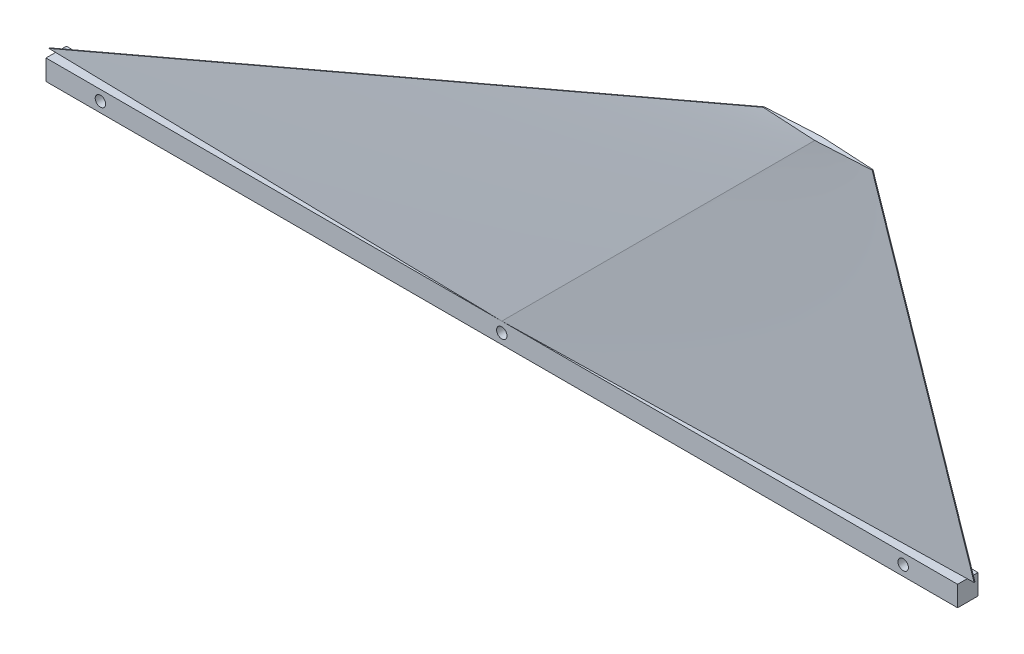
ISO-10303-21;
HEADER;
FILE_DESCRIPTION(('STEP AP214'),'2;1');
FILE_NAME('part.step','',(''),(''),'','','');
FILE_SCHEMA(('AUTOMOTIVE_DESIGN { 1 0 10303 214 1 1 1 1 }'));
ENDSEC;
DATA;
#1=APPLICATION_CONTEXT('core data for automotive mechanical design processes');
#2=APPLICATION_PROTOCOL_DEFINITION('international standard','automotive_design',2000,#1);
#3=PRODUCT_CONTEXT('',#1,'mechanical');
#4=PRODUCT('Part','Part','',(#3));
#5=PRODUCT_RELATED_PRODUCT_CATEGORY('part','',(#4));
#6=PRODUCT_DEFINITION_FORMATION('','',#4);
#7=PRODUCT_DEFINITION_CONTEXT('part definition',#1,'design');
#8=PRODUCT_DEFINITION('design','',#6,#7);
#9=PRODUCT_DEFINITION_SHAPE('','',#8);
#10=(LENGTH_UNIT() NAMED_UNIT(*) SI_UNIT(.MILLI.,.METRE.));
#11=(NAMED_UNIT(*) PLANE_ANGLE_UNIT() SI_UNIT($,.RADIAN.));
#12=(NAMED_UNIT(*) SI_UNIT($,.STERADIAN.) SOLID_ANGLE_UNIT());
#13=UNCERTAINTY_MEASURE_WITH_UNIT(LENGTH_MEASURE(1.E-05),#10,'distance_accuracy_value','');
#14=(GEOMETRIC_REPRESENTATION_CONTEXT(3) GLOBAL_UNCERTAINTY_ASSIGNED_CONTEXT((#13)) GLOBAL_UNIT_ASSIGNED_CONTEXT((#10,
#11,#12)) REPRESENTATION_CONTEXT('',''));
#15=CARTESIAN_POINT('',(0.,0.,0.));
#16=DIRECTION('',(0.,0.,1.));
#17=DIRECTION('',(1.,0.,0.));
#18=AXIS2_PLACEMENT_3D('',#15,#16,#17);
#19=CARTESIAN_POINT('',(0.,9.52500000000001,0.));
#20=DIRECTION('',(0.,1.,0.));
#21=DIRECTION('',(0.,0.,1.));
#22=AXIS2_PLACEMENT_3D('',#19,#20,#21);
#23=PLANE('',#22);
#24=DIRECTION('',(0.,0.,1.));
#25=VECTOR('',#24,1.);
#26=CARTESIAN_POINT('',(-212.725,9.52500000000001,-4.77300000000003));
#27=LINE('',#26,#25);
#28=CARTESIAN_POINT('',(-212.725,9.52500000000001,-4.7625));
#29=VERTEX_POINT('',#28);
#30=CARTESIAN_POINT('',(-212.725,9.52500000000001,-0.270248529411765));
#31=VERTEX_POINT('',#30);
#32=EDGE_CURVE('E490',#29,#31,#27,.T.);
#33=ORIENTED_EDGE('',*,*,#32,.T.);
#34=DIRECTION('',(-0.999777097042099,0.,0.0211129398728302));
#35=VECTOR('',#34,1.);
#36=CARTESIAN_POINT('',(0.,9.52500000000001,-4.7625));
#37=LINE('',#36,#35);
#38=CARTESIAN_POINT('',(0.,9.52500000000001,-4.7625));
#39=VERTEX_POINT('',#38);
#40=EDGE_CURVE('E261',#39,#31,#37,.T.);
#41=ORIENTED_EDGE('',*,*,#40,.F.);
#42=DIRECTION('',(-1.,0.,0.));
#43=VECTOR('',#42,1.);
#44=CARTESIAN_POINT('',(-215.9,9.52500000000001,-4.7625));
#45=LINE('',#44,#43);
#46=EDGE_CURVE('E256',#39,#29,#45,.T.);
#47=ORIENTED_EDGE('',*,*,#46,.T.);
#48=EDGE_LOOP('',(#33,#41,#47));
#49=FACE_BOUND('',#48,.T.);
#50=ADVANCED_FACE('F134',(#49),#23,.T.);
#51=DIRECTION('',(0.,0.,1.));
#52=VECTOR('',#51,1.);
#53=CARTESIAN_POINT('',(212.725,9.52500000000001,-4.77300000000003));
#54=LINE('',#53,#52);
#55=CARTESIAN_POINT('',(212.725,9.52500000000001,-4.7625));
#56=VERTEX_POINT('',#55);
#57=CARTESIAN_POINT('',(212.725,9.52500000000001,-0.270248529411765));
#58=VERTEX_POINT('',#57);
#59=EDGE_CURVE('E239',#56,#58,#54,.T.);
#60=ORIENTED_EDGE('',*,*,#59,.F.);
#61=EDGE_CURVE('E138',#56,#39,#45,.T.);
#62=ORIENTED_EDGE('',*,*,#61,.T.);
#63=DIRECTION('',(-0.999777097042099,0.,-0.0211129398728302));
#64=VECTOR('',#63,1.);
#65=CARTESIAN_POINT('',(215.9,9.52500000000001,-0.203200000000014));
#66=LINE('',#65,#64);
#67=EDGE_CURVE('E277',#58,#39,#66,.T.);
#68=ORIENTED_EDGE('',*,*,#67,.F.);
#69=EDGE_LOOP('',(#60,#62,#68));
#70=FACE_BOUND('',#69,.T.);
#71=ADVANCED_FACE('F450',(#70),#23,.T.);
#72=CARTESIAN_POINT('',(212.725,9.52500000000001,0.270248529411765));
#73=VERTEX_POINT('',#72);
#74=CARTESIAN_POINT('',(212.725,9.52500000000001,4.7625));
#75=VERTEX_POINT('',#74);
#76=EDGE_CURVE('E228',#73,#75,#54,.T.);
#77=ORIENTED_EDGE('',*,*,#76,.F.);
#78=DIRECTION('',(0.999777097042099,0.,-0.0211129398728302));
#79=VECTOR('',#78,1.);
#80=CARTESIAN_POINT('',(0.,9.52500000000001,4.7625));
#81=LINE('',#80,#79);
#82=CARTESIAN_POINT('',(0.,9.52500000000001,4.7625));
#83=VERTEX_POINT('',#82);
#84=EDGE_CURVE('E252',#83,#73,#81,.T.);
#85=ORIENTED_EDGE('',*,*,#84,.F.);
#86=DIRECTION('',(1.,0.,0.));
#87=VECTOR('',#86,1.);
#88=CARTESIAN_POINT('',(-215.9,9.52500000000001,4.7625));
#89=LINE('',#88,#87);
#90=EDGE_CURVE('E245',#83,#75,#89,.T.);
#91=ORIENTED_EDGE('',*,*,#90,.T.);
#92=EDGE_LOOP('',(#77,#85,#91));
#93=FACE_BOUND('',#92,.T.);
#94=ADVANCED_FACE('F251',(#93),#23,.T.);
#95=CARTESIAN_POINT('',(-212.725,9.52500000000001,0.270248529411765));
#96=VERTEX_POINT('',#95);
#97=CARTESIAN_POINT('',(-212.725,9.52500000000001,4.7625));
#98=VERTEX_POINT('',#97);
#99=EDGE_CURVE('E486',#96,#98,#27,.T.);
#100=ORIENTED_EDGE('',*,*,#99,.T.);
#101=EDGE_CURVE('E253',#98,#83,#89,.T.);
#102=ORIENTED_EDGE('',*,*,#101,.T.);
#103=DIRECTION('',(0.999777097042099,0.,0.0211129398728302));
#104=VECTOR('',#103,1.);
#105=CARTESIAN_POINT('',(-215.9,9.52500000000001,0.203200000000014));
#106=LINE('',#105,#104);
#107=EDGE_CURVE('E286',#96,#83,#106,.T.);
#108=ORIENTED_EDGE('',*,*,#107,.F.);
#109=EDGE_LOOP('',(#100,#102,#108));
#110=FACE_BOUND('',#109,.T.);
#111=ADVANCED_FACE('F452',(#110),#23,.T.);
#112=CARTESIAN_POINT('',(-215.9,9.52500000000001,-4.7625));
#113=DIRECTION('',(0.,0.,1.));
#114=DIRECTION('',(1.,0.,0.));
#115=AXIS2_PLACEMENT_3D('',#112,#113,#114);
#116=PLANE('',#115);
#117=CARTESIAN_POINT('',(0.,4.76250000000003,-4.7625));
#118=DIRECTION('',(0.,0.,1.));
#119=DIRECTION('',(1.,0.,0.));
#120=AXIS2_PLACEMENT_3D('',#117,#118,#119);
#121=CIRCLE('',#120,2.4384);
#122=CARTESIAN_POINT('',(2.43839999999994,4.76250000000003,-4.7625));
#123=VERTEX_POINT('',#122);
#124=EDGE_CURVE('E613',#123,#123,#121,.T.);
#125=ORIENTED_EDGE('',*,*,#124,.T.);
#126=EDGE_LOOP('',(#125));
#127=FACE_BOUND('',#126,.T.);
#128=CARTESIAN_POINT('',(187.325,4.76250000000004,-4.7625));
#129=DIRECTION('',(0.,0.,1.));
#130=DIRECTION('',(1.,0.,0.));
#131=AXIS2_PLACEMENT_3D('',#128,#129,#130);
#132=CIRCLE('',#131,2.4384);
#133=CARTESIAN_POINT('',(189.7634,4.76250000000004,-4.7625));
#134=VERTEX_POINT('',#133);
#135=EDGE_CURVE('E473',#134,#134,#132,.T.);
#136=ORIENTED_EDGE('',*,*,#135,.T.);
#137=EDGE_LOOP('',(#136));
#138=FACE_BOUND('',#137,.T.);
#139=CARTESIAN_POINT('',(-187.325,4.7625,-4.7625));
#140=DIRECTION('',(0.,0.,1.));
#141=DIRECTION('',(1.,0.,0.));
#142=AXIS2_PLACEMENT_3D('',#139,#140,#141);
#143=CIRCLE('',#142,2.4384);
#144=CARTESIAN_POINT('',(-184.8866,4.7625,-4.7625));
#145=VERTEX_POINT('',#144);
#146=EDGE_CURVE('E249',#145,#145,#143,.T.);
#147=ORIENTED_EDGE('',*,*,#146,.T.);
#148=EDGE_LOOP('',(#147));
#149=FACE_BOUND('',#148,.T.);
#150=ORIENTED_EDGE('',*,*,#61,.F.);
#151=DIRECTION('',(0.,-1.,0.));
#152=VECTOR('',#151,1.);
#153=CARTESIAN_POINT('',(212.725,9.52500000000001,-4.7625));
#154=LINE('',#153,#152);
#155=CARTESIAN_POINT('',(212.725,0.,-4.7625));
#156=VERTEX_POINT('',#155);
#157=EDGE_CURVE('E481',#56,#156,#154,.T.);
#158=ORIENTED_EDGE('',*,*,#157,.T.);
#159=DIRECTION('',(-1.,0.,0.));
#160=VECTOR('',#159,1.);
#161=CARTESIAN_POINT('',(-215.9,0.,-4.7625));
#162=LINE('',#161,#160);
#163=CARTESIAN_POINT('',(-212.725,0.,-4.7625));
#164=VERTEX_POINT('',#163);
#165=EDGE_CURVE('E267',#156,#164,#162,.T.);
#166=ORIENTED_EDGE('',*,*,#165,.T.);
#167=DIRECTION('',(0.,1.,0.));
#168=VECTOR('',#167,1.);
#169=CARTESIAN_POINT('',(-212.725,9.52500000000001,-4.7625));
#170=LINE('',#169,#168);
#171=EDGE_CURVE('E295',#164,#29,#170,.T.);
#172=ORIENTED_EDGE('',*,*,#171,.T.);
#173=ORIENTED_EDGE('',*,*,#46,.F.);
#174=EDGE_LOOP('',(#150,#158,#166,#172,#173));
#175=FACE_BOUND('',#174,.T.);
#176=ADVANCED_FACE('F136',(#127,#138,#149,#175),#116,.F.);
#177=CARTESIAN_POINT('',(-215.9,9.52500000000001,4.7625));
#178=DIRECTION('',(0.,0.,-1.));
#179=DIRECTION('',(-1.,0.,0.));
#180=AXIS2_PLACEMENT_3D('',#177,#178,#179);
#181=PLANE('',#180);
#182=CARTESIAN_POINT('',(0.,4.76250000000003,4.7625));
#183=DIRECTION('',(0.,0.,1.));
#184=DIRECTION('',(1.,0.,0.));
#185=AXIS2_PLACEMENT_3D('',#182,#183,#184);
#186=CIRCLE('',#185,2.4384);
#187=CARTESIAN_POINT('',(2.43839999999994,4.76250000000003,4.7625));
#188=VERTEX_POINT('',#187);
#189=EDGE_CURVE('E464',#188,#188,#186,.T.);
#190=ORIENTED_EDGE('',*,*,#189,.F.);
#191=EDGE_LOOP('',(#190));
#192=FACE_BOUND('',#191,.T.);
#193=CARTESIAN_POINT('',(187.325,4.76250000000004,4.7625));
#194=DIRECTION('',(0.,0.,1.));
#195=DIRECTION('',(1.,0.,0.));
#196=AXIS2_PLACEMENT_3D('',#193,#194,#195);
#197=CIRCLE('',#196,2.4384);
#198=CARTESIAN_POINT('',(189.7634,4.76250000000004,4.7625));
#199=VERTEX_POINT('',#198);
#200=EDGE_CURVE('E468',#199,#199,#197,.T.);
#201=ORIENTED_EDGE('',*,*,#200,.F.);
#202=EDGE_LOOP('',(#201));
#203=FACE_BOUND('',#202,.T.);
#204=CARTESIAN_POINT('',(-187.325,4.7625,4.7625));
#205=DIRECTION('',(0.,0.,1.));
#206=DIRECTION('',(1.,0.,0.));
#207=AXIS2_PLACEMENT_3D('',#204,#205,#206);
#208=CIRCLE('',#207,2.4384);
#209=CARTESIAN_POINT('',(-184.8866,4.7625,4.7625));
#210=VERTEX_POINT('',#209);
#211=EDGE_CURVE('E471',#210,#210,#208,.T.);
#212=ORIENTED_EDGE('',*,*,#211,.F.);
#213=EDGE_LOOP('',(#212));
#214=FACE_BOUND('',#213,.T.);
#215=DIRECTION('',(1.,0.,0.));
#216=VECTOR('',#215,1.);
#217=CARTESIAN_POINT('',(-215.9,0.,4.7625));
#218=LINE('',#217,#216);
#219=CARTESIAN_POINT('',(-212.725,0.,4.7625));
#220=VERTEX_POINT('',#219);
#221=CARTESIAN_POINT('',(212.725,0.,4.7625));
#222=VERTEX_POINT('',#221);
#223=EDGE_CURVE('E248',#220,#222,#218,.T.);
#224=ORIENTED_EDGE('',*,*,#223,.T.);
#225=DIRECTION('',(0.,-1.,0.));
#226=VECTOR('',#225,1.);
#227=CARTESIAN_POINT('',(212.725,9.52500000000001,4.7625));
#228=LINE('',#227,#226);
#229=EDGE_CURVE('E232',#75,#222,#228,.T.);
#230=ORIENTED_EDGE('',*,*,#229,.F.);
#231=ORIENTED_EDGE('',*,*,#90,.F.);
#232=ORIENTED_EDGE('',*,*,#101,.F.);
#233=DIRECTION('',(0.,1.,0.));
#234=VECTOR('',#233,1.);
#235=CARTESIAN_POINT('',(-212.725,9.52500000000001,4.7625));
#236=LINE('',#235,#234);
#237=EDGE_CURVE('E484',#220,#98,#236,.T.);
#238=ORIENTED_EDGE('',*,*,#237,.F.);
#239=EDGE_LOOP('',(#224,#230,#231,#232,#238));
#240=FACE_BOUND('',#239,.T.);
#241=ADVANCED_FACE('F243',(#192,#203,#214,#240),#181,.F.);
#242=CARTESIAN_POINT('',(0.,0.,0.));
#243=DIRECTION('',(0.,1.,0.));
#244=DIRECTION('',(0.,0.,1.));
#245=AXIS2_PLACEMENT_3D('',#242,#243,#244);
#246=PLANE('',#245);
#247=ORIENTED_EDGE('',*,*,#165,.F.);
#248=DIRECTION('',(0.,0.,1.));
#249=VECTOR('',#248,1.);
#250=CARTESIAN_POINT('',(212.725,0.,0.));
#251=LINE('',#250,#249);
#252=EDGE_CURVE('E15',#156,#222,#251,.T.);
#253=ORIENTED_EDGE('',*,*,#252,.T.);
#254=ORIENTED_EDGE('',*,*,#223,.F.);
#255=DIRECTION('',(0.,0.,-1.));
#256=VECTOR('',#255,1.);
#257=CARTESIAN_POINT('',(-212.725,0.,0.));
#258=LINE('',#257,#256);
#259=EDGE_CURVE('E144',#220,#164,#258,.T.);
#260=ORIENTED_EDGE('',*,*,#259,.T.);
#261=EDGE_LOOP('',(#247,#253,#254,#260));
#262=FACE_BOUND('',#261,.T.);
#263=ADVANCED_FACE('F384',(#262),#246,.F.);
#264=CARTESIAN_POINT('',(0.,152.4,0.));
#265=DIRECTION('',(0.,1.,0.));
#266=DIRECTION('',(0.,0.,1.));
#267=AXIS2_PLACEMENT_3D('',#264,#265,#266);
#268=PLANE('',#267);
#269=DIRECTION('',(0.998518175226659,0.,0.054419240549853));
#270=VECTOR('',#269,1.);
#271=CARTESIAN_POINT('',(117.475,152.4,0.203200000000014));
#272=LINE('',#271,#270);
#273=CARTESIAN_POINT('',(117.475,152.4,0.203200000000014));
#274=VERTEX_POINT('',#273);
#275=CARTESIAN_POINT('',(142.875,152.4,1.58750000000002));
#276=VERTEX_POINT('',#275);
#277=EDGE_CURVE('E324',#274,#276,#272,.T.);
#278=ORIENTED_EDGE('',*,*,#277,.T.);
#279=DIRECTION('',(0.998518175226659,0.,-0.0544192405498529));
#280=VECTOR('',#279,1.);
#281=CARTESIAN_POINT('',(142.875,152.4,1.58750000000002));
#282=LINE('',#281,#280);
#283=CARTESIAN_POINT('',(168.275,152.4,0.203200000000014));
#284=VERTEX_POINT('',#283);
#285=EDGE_CURVE('E321',#276,#284,#282,.T.);
#286=ORIENTED_EDGE('',*,*,#285,.T.);
#287=DIRECTION('',(0.,0.,-1.));
#288=VECTOR('',#287,1.);
#289=CARTESIAN_POINT('',(168.275,152.4,0.203200000000014));
#290=LINE('',#289,#288);
#291=CARTESIAN_POINT('',(168.275,152.4,-0.203200000000014));
#292=VERTEX_POINT('',#291);
#293=EDGE_CURVE('E423',#284,#292,#290,.T.);
#294=ORIENTED_EDGE('',*,*,#293,.T.);
#295=DIRECTION('',(-0.998518175226659,0.,-0.0544192405498529));
#296=VECTOR('',#295,1.);
#297=CARTESIAN_POINT('',(142.875,152.4,-1.58750000000002));
#298=LINE('',#297,#296);
#299=CARTESIAN_POINT('',(142.875,152.4,-1.58750000000002));
#300=VERTEX_POINT('',#299);
#301=EDGE_CURVE('E427',#292,#300,#298,.T.);
#302=ORIENTED_EDGE('',*,*,#301,.T.);
#303=DIRECTION('',(-0.998518175226659,0.,0.0544192405498536));
#304=VECTOR('',#303,1.);
#305=CARTESIAN_POINT('',(117.475,152.4,-0.203199999999959));
#306=LINE('',#305,#304);
#307=CARTESIAN_POINT('',(117.475,152.4,-0.203199999999959));
#308=VERTEX_POINT('',#307);
#309=EDGE_CURVE('E524',#300,#308,#306,.T.);
#310=ORIENTED_EDGE('',*,*,#309,.T.);
#311=DIRECTION('',(0.,0.,1.));
#312=VECTOR('',#311,1.);
#313=CARTESIAN_POINT('',(117.475,152.4,0.203200000000014));
#314=LINE('',#313,#312);
#315=EDGE_CURVE('E158',#308,#274,#314,.T.);
#316=ORIENTED_EDGE('',*,*,#315,.T.);
#317=EDGE_LOOP('',(#278,#286,#294,#302,#310,#316));
#318=FACE_BOUND('',#317,.T.);
#319=ADVANCED_FACE('F370',(#318),#268,.T.);
#320=CARTESIAN_POINT('',(-215.9,9.52500000000001,0.203200000000014));
#321=CARTESIAN_POINT('',(-104.775,57.15,0.203200000000014));
#322=CARTESIAN_POINT('',(6.34999999999999,104.775,0.203200000000014));
#323=CARTESIAN_POINT('',(117.475,152.4,0.203200000000014));
#324=CARTESIAN_POINT('',(-197.908333333333,9.52500000000001,0.583141666666676));
#325=CARTESIAN_POINT('',(-92.075,57.15,0.494947222222208));
#326=CARTESIAN_POINT('',(13.7583333333333,104.775,0.406752777777797));
#327=CARTESIAN_POINT('',(119.591666666667,152.4,0.31855833333333));
#328=CARTESIAN_POINT('',(-161.925,9.52500000000001,1.343025));
#329=CARTESIAN_POINT('',(-66.675,57.1500000000001,1.07844166666665));
#330=CARTESIAN_POINT('',(28.5750000000001,104.775,0.813858333333362));
#331=CARTESIAN_POINT('',(123.825,152.4,0.549275000000016));
#332=CARTESIAN_POINT('',(-107.95,9.52499999999999,2.48284999999998));
#333=CARTESIAN_POINT('',(-28.575,57.1499999999999,1.95368333333334));
#334=CARTESIAN_POINT('',(50.8,104.775,1.42451666666665));
#335=CARTESIAN_POINT('',(130.175,152.4,0.895350000000017));
#336=CARTESIAN_POINT('',(-53.9749999999999,9.52500000000001,3.62267500000002));
#337=CARTESIAN_POINT('',(9.52500000000006,57.1500000000001,2.82892499999998));
#338=CARTESIAN_POINT('',(73.0250000000001,104.775,2.035175));
#339=CARTESIAN_POINT('',(136.525,152.4,1.24142500000002));
#340=CARTESIAN_POINT('',(-17.9916666666666,9.52500000000001,4.38255833333334));
#341=CARTESIAN_POINT('',(34.925,57.15,3.41241944444443));
#342=CARTESIAN_POINT('',(87.8416666666667,104.775,2.44228055555556));
#343=CARTESIAN_POINT('',(140.758333333333,152.4,1.47214166666665));
#344=CARTESIAN_POINT('',(0.,9.52500000000001,4.7625));
#345=CARTESIAN_POINT('',(47.625,57.15,3.70416666666668));
#346=CARTESIAN_POINT('',(95.25,104.775,2.64583333333335));
#347=CARTESIAN_POINT('',(142.875,152.4,1.58750000000002));
#348=B_SPLINE_SURFACE_WITH_KNOTS('',3,3,((#320,#321,#322,#323),(#324,#325,#326,#327),(#328,#329,
#330,#331),(#332,#333,#334,#335),(#336,#337,#338,#339),(#340,#341,#342,#343),(#344,#345,#346,
#347)),.UNSPECIFIED.,.F.,.F.,.F.,(4,1,1,1,4),(4,4),(0.751108115339535,0.813331086504651,
0.875554057669767,0.937777028834884,1.),(0.,1.),.UNSPECIFIED.);
#349=CARTESIAN_POINT('',(-215.9,9.52500000000001,0.203200000000014));
#350=VERTEX_POINT('',#349);
#351=EDGE_CURVE('E276',#350,#96,#106,.T.);
#352=CARTESIAN_POINT('',(0.,9.52500000000001,4.7625));
#353=CARTESIAN_POINT('',(47.625,57.15,3.70416666666668));
#354=CARTESIAN_POINT('',(95.25,104.775,2.64583333333335));
#355=CARTESIAN_POINT('',(142.875,152.4,1.58750000000002));
#356=B_SPLINE_CURVE_WITH_KNOTS('',3,(#352,#353,#354,#355),.UNSPECIFIED.,.F.,.F.,(4,4),(0.,1.),.UNSPECIFIED.);
#357=EDGE_CURVE('E319',#83,#276,#356,.T.);
#358=CARTESIAN_POINT('',(-215.9,9.52500000000001,0.203200000000014));
#359=CARTESIAN_POINT('',(-104.775,57.15,0.203200000000014));
#360=CARTESIAN_POINT('',(6.34999999999999,104.775,0.203200000000014));
#361=CARTESIAN_POINT('',(117.475,152.4,0.203200000000014));
#362=B_SPLINE_CURVE_WITH_KNOTS('',3,(#358,#359,#360,#361),.UNSPECIFIED.,.F.,.F.,(4,4),(0.,1.),.UNSPECIFIED.);
#363=EDGE_CURVE('E325',#350,#274,#362,.T.);
#364=ORIENTED_EDGE('',*,*,#351,.T.);
#365=ORIENTED_EDGE('',*,*,#107,.T.);
#366=ORIENTED_EDGE('',*,*,#357,.T.);
#367=ORIENTED_EDGE('',*,*,#277,.F.);
#368=ORIENTED_EDGE('',*,*,#363,.F.);
#369=EDGE_LOOP('',(#364,#365,#366,#367,#368));
#370=FACE_BOUND('',#369,.T.);
#371=ADVANCED_FACE('F357',(#370),#348,.T.);
#372=CARTESIAN_POINT('',(-215.9,9.52500000000001,-0.203200000000014));
#373=DIRECTION('',(-0.393919298579168,0.919145030018058,0.));
#374=DIRECTION('',(-2.0488859952482E-13,0.,1.));
#375=AXIS2_PLACEMENT_3D('',#372,#373,#374);
#376=PLANE('',#375);
#377=DIRECTION('',(-2.0488859952482E-13,0.,1.));
#378=VECTOR('',#377,1.);
#379=CARTESIAN_POINT('',(-215.9,9.52500000000001,0.203200000000014));
#380=LINE('',#379,#378);
#381=CARTESIAN_POINT('',(-215.9,9.52500000000001,-0.203200000000014));
#382=VERTEX_POINT('',#381);
#383=EDGE_CURVE('E289',#382,#350,#380,.T.);
#384=ORIENTED_EDGE('',*,*,#383,.T.);
#385=ORIENTED_EDGE('',*,*,#363,.T.);
#386=ORIENTED_EDGE('',*,*,#315,.F.);
#387=CARTESIAN_POINT('',(-215.9,9.52500000000001,-0.203200000000014));
#388=CARTESIAN_POINT('',(-104.775,57.15,-0.203200000000014));
#389=CARTESIAN_POINT('',(6.35000000000002,104.775,-0.203199999999959));
#390=CARTESIAN_POINT('',(117.475,152.4,-0.203199999999959));
#391=B_SPLINE_CURVE_WITH_KNOTS('',3,(#387,#388,#389,#390),.UNSPECIFIED.,.F.,.F.,(4,4),(0.,1.),.UNSPECIFIED.);
#392=EDGE_CURVE('E151',#382,#308,#391,.T.);
#393=ORIENTED_EDGE('',*,*,#392,.F.);
#394=EDGE_LOOP('',(#384,#385,#386,#393));
#395=FACE_BOUND('',#394,.T.);
#396=ADVANCED_FACE('F369',(#395),#376,.T.);
#397=CARTESIAN_POINT('',(0.,9.52500000000001,-4.7625));
#398=CARTESIAN_POINT('',(47.625,57.15,-3.70416666666668));
#399=CARTESIAN_POINT('',(95.25,104.775,-2.64583333333335));
#400=CARTESIAN_POINT('',(142.875,152.4,-1.58750000000002));
#401=CARTESIAN_POINT('',(-17.9916666666667,9.52500000000001,-4.38255833333334));
#402=CARTESIAN_POINT('',(34.925,57.15,-3.41241944444443));
#403=CARTESIAN_POINT('',(87.8416666666667,104.775,-2.44228055555556));
#404=CARTESIAN_POINT('',(140.758333333333,152.4,-1.47214166666665));
#405=CARTESIAN_POINT('',(-53.9750000000002,9.52500000000001,-3.62267500000002));
#406=CARTESIAN_POINT('',(9.5249999999999,57.1500000000001,-2.82892499999998));
#407=CARTESIAN_POINT('',(73.0249999999999,104.775,-2.035175));
#408=CARTESIAN_POINT('',(136.525,152.4,-1.24142500000002));
#409=CARTESIAN_POINT('',(-107.95,9.52499999999999,-2.48284999999998));
#410=CARTESIAN_POINT('',(-28.5749999999999,57.1499999999999,-1.95368333333334));
#411=CARTESIAN_POINT('',(50.8,104.775,-1.42451666666665));
#412=CARTESIAN_POINT('',(130.175,152.4,-0.895349999999961));
#413=CARTESIAN_POINT('',(-161.925,9.52500000000001,-1.343025));
#414=CARTESIAN_POINT('',(-66.6750000000001,57.1500000000001,-1.07844166666665));
#415=CARTESIAN_POINT('',(28.575,104.775,-0.813858333333306));
#416=CARTESIAN_POINT('',(123.825,152.4,-0.54927499999996));
#417=CARTESIAN_POINT('',(-197.908333333333,9.52500000000001,-0.583141666666676));
#418=CARTESIAN_POINT('',(-92.0750000000001,57.15,-0.494947222222208));
#419=CARTESIAN_POINT('',(13.7583333333333,104.775,-0.406752777777741));
#420=CARTESIAN_POINT('',(119.591666666667,152.4,-0.31855833333333));
#421=CARTESIAN_POINT('',(-215.9,9.52500000000001,-0.203200000000014));
#422=CARTESIAN_POINT('',(-104.775,57.15,-0.203200000000014));
#423=CARTESIAN_POINT('',(6.35000000000002,104.775,-0.203199999999959));
#424=CARTESIAN_POINT('',(117.475,152.4,-0.203199999999959));
#425=B_SPLINE_SURFACE_WITH_KNOTS('',3,3,((#397,#398,#399,#400),(#401,#402,#403,#404),(#405,#406,
#407,#408),(#409,#410,#411,#412),(#413,#414,#415,#416),(#417,#418,#419,#420),(#421,#422,#423,
#424)),.UNSPECIFIED.,.F.,.F.,.F.,(4,1,1,1,4),(4,4),(0.5,0.562222971165117,0.624445942330233,
0.686668913495349,0.748891884660466),(0.,1.),.UNSPECIFIED.);
#426=EDGE_CURVE('E294',#31,#382,#37,.T.);
#427=CARTESIAN_POINT('',(0.,9.52500000000001,-4.7625));
#428=CARTESIAN_POINT('',(47.625,57.15,-3.70416666666668));
#429=CARTESIAN_POINT('',(95.25,104.775,-2.64583333333335));
#430=CARTESIAN_POINT('',(142.875,152.4,-1.58750000000002));
#431=B_SPLINE_CURVE_WITH_KNOTS('',3,(#427,#428,#429,#430),.UNSPECIFIED.,.F.,.F.,(4,4),(0.,1.),.UNSPECIFIED.);
#432=EDGE_CURVE('E494',#39,#300,#431,.T.);
#433=ORIENTED_EDGE('',*,*,#40,.T.);
#434=ORIENTED_EDGE('',*,*,#426,.T.);
#435=ORIENTED_EDGE('',*,*,#392,.T.);
#436=ORIENTED_EDGE('',*,*,#309,.F.);
#437=ORIENTED_EDGE('',*,*,#432,.F.);
#438=EDGE_LOOP('',(#433,#434,#435,#436,#437));
#439=FACE_BOUND('',#438,.T.);
#440=ADVANCED_FACE('F371',(#439),#425,.T.);
#441=CARTESIAN_POINT('',(215.9,9.52500000000001,-0.203200000000014));
#442=CARTESIAN_POINT('',(200.025,57.15,-0.203200000000014));
#443=CARTESIAN_POINT('',(184.15,104.775,-0.203200000000014));
#444=CARTESIAN_POINT('',(168.275,152.4,-0.203200000000014));
#445=CARTESIAN_POINT('',(197.908333333333,9.52500000000001,-0.583141666666676));
#446=CARTESIAN_POINT('',(187.325,57.15,-0.494947222222208));
#447=CARTESIAN_POINT('',(176.741666666667,104.775,-0.406752777777797));
#448=CARTESIAN_POINT('',(166.158333333333,152.4,-0.31855833333333));
#449=CARTESIAN_POINT('',(161.925,9.52500000000001,-1.343025));
#450=CARTESIAN_POINT('',(161.925,57.1500000000001,-1.07844166666665));
#451=CARTESIAN_POINT('',(161.925,104.775,-0.813858333333306));
#452=CARTESIAN_POINT('',(161.925,152.4,-0.549275000000016));
#453=CARTESIAN_POINT('',(107.95,9.52499999999999,-2.48284999999998));
#454=CARTESIAN_POINT('',(123.825,57.1499999999999,-1.95368333333334));
#455=CARTESIAN_POINT('',(139.7,104.775,-1.42451666666665));
#456=CARTESIAN_POINT('',(155.575,152.4,-0.895350000000017));
#457=CARTESIAN_POINT('',(53.975,9.52500000000001,-3.62267500000002));
#458=CARTESIAN_POINT('',(85.7250000000001,57.1500000000001,-2.82892499999998));
#459=CARTESIAN_POINT('',(117.475,104.775,-2.035175));
#460=CARTESIAN_POINT('',(149.225,152.4,-1.24142500000002));
#461=CARTESIAN_POINT('',(17.9916666666666,9.52500000000001,-4.38255833333334));
#462=CARTESIAN_POINT('',(60.325,57.15,-3.41241944444443));
#463=CARTESIAN_POINT('',(102.658333333333,104.775,-2.44228055555556));
#464=CARTESIAN_POINT('',(144.991666666667,152.4,-1.47214166666665));
#465=CARTESIAN_POINT('',(0.,9.52500000000001,-4.7625));
#466=CARTESIAN_POINT('',(47.625,57.15,-3.70416666666668));
#467=CARTESIAN_POINT('',(95.25,104.775,-2.64583333333335));
#468=CARTESIAN_POINT('',(142.875,152.4,-1.58750000000002));
#469=B_SPLINE_SURFACE_WITH_KNOTS('',3,3,((#441,#442,#443,#444),(#445,#446,#447,#448),(#449,#450,
#451,#452),(#453,#454,#455,#456),(#457,#458,#459,#460),(#461,#462,#463,#464),(#465,#466,#467,
#468)),.UNSPECIFIED.,.F.,.F.,.F.,(4,1,1,1,4),(4,4),(0.251108115339535,0.313331086504651,
0.375554057669767,0.437777028834884,0.5),(0.,1.),.UNSPECIFIED.);
#470=CARTESIAN_POINT('',(215.9,9.52500000000001,-0.203200000000014));
#471=VERTEX_POINT('',#470);
#472=EDGE_CURVE('E299',#471,#58,#66,.T.);
#473=CARTESIAN_POINT('',(215.9,9.52500000000001,-0.203200000000014));
#474=CARTESIAN_POINT('',(200.025,57.15,-0.203200000000014));
#475=CARTESIAN_POINT('',(184.15,104.775,-0.203200000000014));
#476=CARTESIAN_POINT('',(168.275,152.4,-0.203200000000014));
#477=B_SPLINE_CURVE_WITH_KNOTS('',3,(#473,#474,#475,#476),.UNSPECIFIED.,.F.,.F.,(4,4),(0.,1.),.UNSPECIFIED.);
#478=EDGE_CURVE('E343',#471,#292,#477,.T.);
#479=ORIENTED_EDGE('',*,*,#472,.T.);
#480=ORIENTED_EDGE('',*,*,#67,.T.);
#481=ORIENTED_EDGE('',*,*,#432,.T.);
#482=ORIENTED_EDGE('',*,*,#301,.F.);
#483=ORIENTED_EDGE('',*,*,#478,.F.);
#484=EDGE_LOOP('',(#479,#480,#481,#482,#483));
#485=FACE_BOUND('',#484,.T.);
#486=ADVANCED_FACE('F447',(#485),#469,.T.);
#487=CARTESIAN_POINT('',(215.9,9.52500000000001,0.203200000000014));
#488=DIRECTION('',(0.948683298050514,0.316227766016838,0.));
#489=DIRECTION('',(0.,0.,-1.));
#490=AXIS2_PLACEMENT_3D('',#487,#488,#489);
#491=PLANE('',#490);
#492=DIRECTION('',(0.,0.,-1.));
#493=VECTOR('',#492,1.);
#494=CARTESIAN_POINT('',(215.9,9.52500000000001,0.203200000000014));
#495=LINE('',#494,#493);
#496=CARTESIAN_POINT('',(215.9,9.52500000000001,0.203200000000014));
#497=VERTEX_POINT('',#496);
#498=EDGE_CURVE('E305',#497,#471,#495,.T.);
#499=ORIENTED_EDGE('',*,*,#498,.T.);
#500=ORIENTED_EDGE('',*,*,#478,.T.);
#501=ORIENTED_EDGE('',*,*,#293,.F.);
#502=CARTESIAN_POINT('',(215.9,9.52500000000001,0.203200000000014));
#503=CARTESIAN_POINT('',(200.025,57.15,0.203200000000014));
#504=CARTESIAN_POINT('',(184.15,104.775,0.203200000000014));
#505=CARTESIAN_POINT('',(168.275,152.4,0.203200000000014));
#506=B_SPLINE_CURVE_WITH_KNOTS('',3,(#502,#503,#504,#505),.UNSPECIFIED.,.F.,.F.,(4,4),(0.,1.),.UNSPECIFIED.);
#507=EDGE_CURVE('E302',#497,#284,#506,.T.);
#508=ORIENTED_EDGE('',*,*,#507,.F.);
#509=EDGE_LOOP('',(#499,#500,#501,#508));
#510=FACE_BOUND('',#509,.T.);
#511=ADVANCED_FACE('F432',(#510),#491,.T.);
#512=CARTESIAN_POINT('',(0.,9.52500000000001,4.7625));
#513=CARTESIAN_POINT('',(47.625,57.15,3.70416666666668));
#514=CARTESIAN_POINT('',(95.25,104.775,2.64583333333335));
#515=CARTESIAN_POINT('',(142.875,152.4,1.58750000000002));
#516=CARTESIAN_POINT('',(17.9916666666667,9.52500000000001,4.38255833333334));
#517=CARTESIAN_POINT('',(60.325,57.15,3.41241944444443));
#518=CARTESIAN_POINT('',(102.658333333333,104.775,2.44228055555556));
#519=CARTESIAN_POINT('',(144.991666666667,152.4,1.47214166666665));
#520=CARTESIAN_POINT('',(53.975,9.52500000000001,3.62267500000002));
#521=CARTESIAN_POINT('',(85.725,57.1500000000001,2.82892499999998));
#522=CARTESIAN_POINT('',(117.475,104.775,2.035175));
#523=CARTESIAN_POINT('',(149.225,152.4,1.24142500000002));
#524=CARTESIAN_POINT('',(107.95,9.52499999999998,2.48284999999998));
#525=CARTESIAN_POINT('',(123.825,57.1499999999999,1.95368333333334));
#526=CARTESIAN_POINT('',(139.7,104.775,1.42451666666665));
#527=CARTESIAN_POINT('',(155.575,152.4,0.895350000000017));
#528=CARTESIAN_POINT('',(161.925,9.52500000000002,1.343025));
#529=CARTESIAN_POINT('',(161.925,57.1500000000001,1.07844166666665));
#530=CARTESIAN_POINT('',(161.925,104.775,0.813858333333362));
#531=CARTESIAN_POINT('',(161.925,152.4,0.549275000000016));
#532=CARTESIAN_POINT('',(197.908333333333,9.52500000000001,0.583141666666676));
#533=CARTESIAN_POINT('',(187.325,57.15,0.494947222222208));
#534=CARTESIAN_POINT('',(176.741666666667,104.775,0.406752777777797));
#535=CARTESIAN_POINT('',(166.158333333333,152.4,0.31855833333333));
#536=CARTESIAN_POINT('',(215.9,9.52500000000001,0.203200000000014));
#537=CARTESIAN_POINT('',(200.025,57.15,0.203200000000014));
#538=CARTESIAN_POINT('',(184.15,104.775,0.203200000000014));
#539=CARTESIAN_POINT('',(168.275,152.4,0.203200000000014));
#540=B_SPLINE_SURFACE_WITH_KNOTS('',3,3,((#512,#513,#514,#515),(#516,#517,#518,#519),(#520,#521,
#522,#523),(#524,#525,#526,#527),(#528,#529,#530,#531),(#532,#533,#534,#535),(#536,#537,#538,
#539)),.UNSPECIFIED.,.F.,.F.,.F.,(4,1,1,1,4),(4,4),(0.,0.0622229711651164,0.124445942330233,
0.186668913495349,0.248891884660465),(0.,1.),.UNSPECIFIED.);
#541=EDGE_CURVE('E272',#73,#497,#81,.T.);
#542=ORIENTED_EDGE('',*,*,#84,.T.);
#543=ORIENTED_EDGE('',*,*,#541,.T.);
#544=ORIENTED_EDGE('',*,*,#507,.T.);
#545=ORIENTED_EDGE('',*,*,#285,.F.);
#546=ORIENTED_EDGE('',*,*,#357,.F.);
#547=EDGE_LOOP('',(#542,#543,#544,#545,#546));
#548=FACE_BOUND('',#547,.T.);
#549=ADVANCED_FACE('F316',(#548),#540,.T.);
#550=CARTESIAN_POINT('',(-212.725,9.52500000000001,-4.77300000000003));
#551=DIRECTION('',(1.,0.,0.));
#552=DIRECTION('',(0.,0.,-1.));
#553=AXIS2_PLACEMENT_3D('',#550,#551,#552);
#554=PLANE('',#553);
#555=ORIENTED_EDGE('',*,*,#259,.F.);
#556=ORIENTED_EDGE('',*,*,#237,.T.);
#557=ORIENTED_EDGE('',*,*,#99,.F.);
#558=EDGE_CURVE('E489',#31,#96,#27,.T.);
#559=ORIENTED_EDGE('',*,*,#558,.F.);
#560=ORIENTED_EDGE('',*,*,#32,.F.);
#561=ORIENTED_EDGE('',*,*,#171,.F.);
#562=EDGE_LOOP('',(#555,#556,#557,#559,#560,#561));
#563=FACE_BOUND('',#562,.T.);
#564=ADVANCED_FACE('F572',(#563),#554,.F.);
#565=CARTESIAN_POINT('',(-215.9,9.52500000000001,-4.77300000000003));
#566=DIRECTION('',(0.,1.,0.));
#567=DIRECTION('',(0.,0.,1.));
#568=AXIS2_PLACEMENT_3D('',#565,#566,#567);
#569=PLANE('',#568);
#570=ORIENTED_EDGE('',*,*,#351,.F.);
#571=ORIENTED_EDGE('',*,*,#383,.F.);
#572=ORIENTED_EDGE('',*,*,#426,.F.);
#573=ORIENTED_EDGE('',*,*,#558,.T.);
#574=EDGE_LOOP('',(#570,#571,#572,#573));
#575=FACE_BOUND('',#574,.T.);
#576=ADVANCED_FACE('F587',(#575),#569,.F.);
#577=CARTESIAN_POINT('',(212.725,9.52500000000001,-4.77300000000003));
#578=DIRECTION('',(-1.,0.,0.));
#579=DIRECTION('',(0.,0.,1.));
#580=AXIS2_PLACEMENT_3D('',#577,#578,#579);
#581=PLANE('',#580);
#582=ORIENTED_EDGE('',*,*,#59,.T.);
#583=EDGE_CURVE('E233',#58,#73,#54,.T.);
#584=ORIENTED_EDGE('',*,*,#583,.T.);
#585=ORIENTED_EDGE('',*,*,#76,.T.);
#586=ORIENTED_EDGE('',*,*,#229,.T.);
#587=ORIENTED_EDGE('',*,*,#252,.F.);
#588=ORIENTED_EDGE('',*,*,#157,.F.);
#589=EDGE_LOOP('',(#582,#584,#585,#586,#587,#588));
#590=FACE_BOUND('',#589,.T.);
#591=ADVANCED_FACE('F231',(#590),#581,.F.);
#592=CARTESIAN_POINT('',(215.9,9.52500000000001,-4.77300000000003));
#593=DIRECTION('',(0.,1.,0.));
#594=DIRECTION('',(0.,0.,1.));
#595=AXIS2_PLACEMENT_3D('',#592,#593,#594);
#596=PLANE('',#595);
#597=ORIENTED_EDGE('',*,*,#472,.F.);
#598=ORIENTED_EDGE('',*,*,#498,.F.);
#599=ORIENTED_EDGE('',*,*,#541,.F.);
#600=ORIENTED_EDGE('',*,*,#583,.F.);
#601=EDGE_LOOP('',(#597,#598,#599,#600));
#602=FACE_BOUND('',#601,.T.);
#603=ADVANCED_FACE('F592',(#602),#596,.F.);
#604=CARTESIAN_POINT('',(-187.325,4.7625,-4.77300000000003));
#605=DIRECTION('',(0.,0.,1.));
#606=DIRECTION('',(1.,0.,0.));
#607=AXIS2_PLACEMENT_3D('',#604,#605,#606);
#608=CYLINDRICAL_SURFACE('',#607,2.4384);
#609=ORIENTED_EDGE('',*,*,#211,.T.);
#610=EDGE_LOOP('',(#609));
#611=FACE_BOUND('',#610,.T.);
#612=ORIENTED_EDGE('',*,*,#146,.F.);
#613=EDGE_LOOP('',(#612));
#614=FACE_BOUND('',#613,.T.);
#615=ADVANCED_FACE('F595',(#611,#614),#608,.F.);
#616=CARTESIAN_POINT('',(187.325,4.76250000000004,-4.77300000000003));
#617=DIRECTION('',(0.,0.,1.));
#618=DIRECTION('',(1.,0.,0.));
#619=AXIS2_PLACEMENT_3D('',#616,#617,#618);
#620=CYLINDRICAL_SURFACE('',#619,2.4384);
#621=ORIENTED_EDGE('',*,*,#200,.T.);
#622=EDGE_LOOP('',(#621));
#623=FACE_BOUND('',#622,.T.);
#624=ORIENTED_EDGE('',*,*,#135,.F.);
#625=EDGE_LOOP('',(#624));
#626=FACE_BOUND('',#625,.T.);
#627=ADVANCED_FACE('F601',(#623,#626),#620,.F.);
#628=CARTESIAN_POINT('',(0.,4.76250000000003,-4.77300000000003));
#629=DIRECTION('',(0.,0.,1.));
#630=DIRECTION('',(1.,0.,0.));
#631=AXIS2_PLACEMENT_3D('',#628,#629,#630);
#632=CYLINDRICAL_SURFACE('',#631,2.4384);
#633=ORIENTED_EDGE('',*,*,#189,.T.);
#634=EDGE_LOOP('',(#633));
#635=FACE_BOUND('',#634,.T.);
#636=ORIENTED_EDGE('',*,*,#124,.F.);
#637=EDGE_LOOP('',(#636));
#638=FACE_BOUND('',#637,.T.);
#639=ADVANCED_FACE('F604',(#635,#638),#632,.F.);
#640=CLOSED_SHELL('',(#50,#71,#94,#111,#176,#241,#263,#319,#371,#396,#440,#486,#511,#549,#564,
#576,#591,#603,#615,#627,#639));
#641=MANIFOLD_SOLID_BREP('B2',#640);
#642=ADVANCED_BREP_SHAPE_REPRESENTATION('',(#18,#641),#14);
#643=SHAPE_DEFINITION_REPRESENTATION(#9,#642);
ENDSEC;
END-ISO-10303-21;
